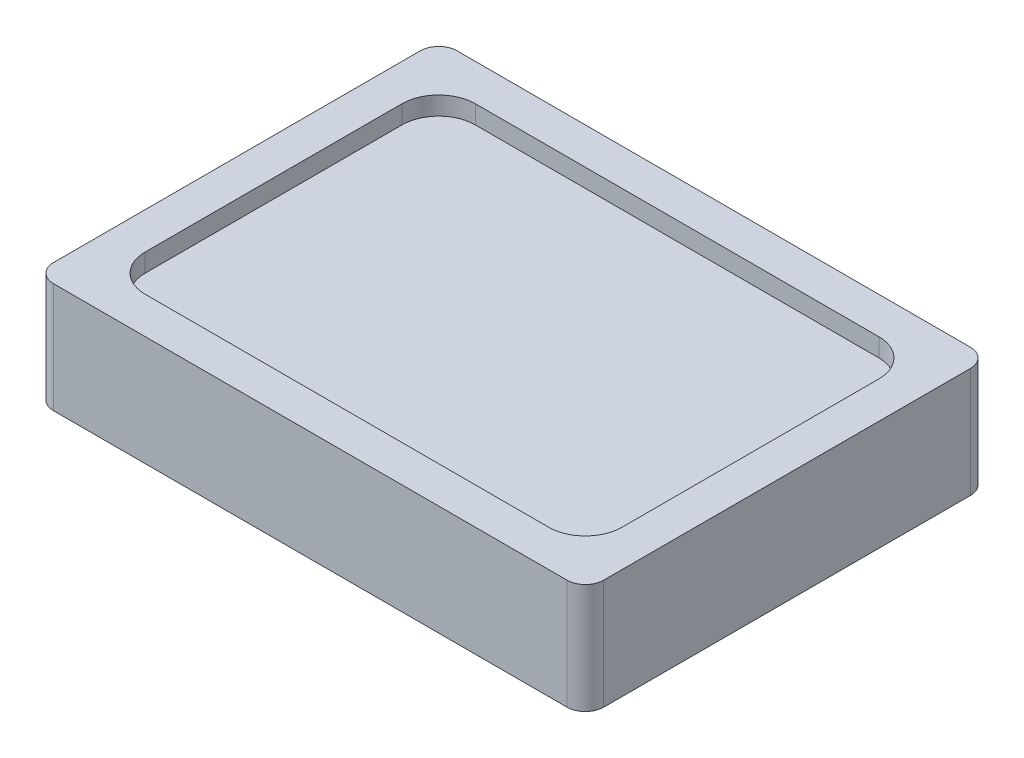
ISO-10303-21;
HEADER;
FILE_DESCRIPTION(('STEP AP214'),'2;1');
FILE_NAME('part.step','',(''),(''),'','','');
FILE_SCHEMA(('AUTOMOTIVE_DESIGN { 1 0 10303 214 1 1 1 1 }'));
ENDSEC;
DATA;
#1=APPLICATION_CONTEXT('core data for automotive mechanical design processes');
#2=APPLICATION_PROTOCOL_DEFINITION('international standard','automotive_design',2000,#1);
#3=PRODUCT_CONTEXT('',#1,'mechanical');
#4=PRODUCT('Part','Part','',(#3));
#5=PRODUCT_RELATED_PRODUCT_CATEGORY('part','',(#4));
#6=PRODUCT_DEFINITION_FORMATION('','',#4);
#7=PRODUCT_DEFINITION_CONTEXT('part definition',#1,'design');
#8=PRODUCT_DEFINITION('design','',#6,#7);
#9=PRODUCT_DEFINITION_SHAPE('','',#8);
#10=(LENGTH_UNIT() NAMED_UNIT(*) SI_UNIT(.MILLI.,.METRE.));
#11=(NAMED_UNIT(*) PLANE_ANGLE_UNIT() SI_UNIT($,.RADIAN.));
#12=(NAMED_UNIT(*) SI_UNIT($,.STERADIAN.) SOLID_ANGLE_UNIT());
#13=UNCERTAINTY_MEASURE_WITH_UNIT(LENGTH_MEASURE(1.E-05),#10,'distance_accuracy_value','');
#14=(GEOMETRIC_REPRESENTATION_CONTEXT(3) GLOBAL_UNCERTAINTY_ASSIGNED_CONTEXT((#13)) GLOBAL_UNIT_ASSIGNED_CONTEXT((#10,
#11,#12)) REPRESENTATION_CONTEXT('',''));
#15=CARTESIAN_POINT('',(0.,0.,0.));
#16=DIRECTION('',(0.,0.,1.));
#17=DIRECTION('',(1.,0.,0.));
#18=AXIS2_PLACEMENT_3D('',#15,#16,#17);
#19=CARTESIAN_POINT('',(-5.5,2.5,3.5));
#20=DIRECTION('',(0.,-1.,0.));
#21=DIRECTION('',(0.,0.,-1.));
#22=AXIS2_PLACEMENT_3D('',#19,#20,#21);
#23=PLANE('',#22);
#24=DIRECTION('',(1.,0.,0.));
#25=VECTOR('',#24,1.);
#26=CARTESIAN_POINT('',(5.5,2.5,4.5));
#27=LINE('',#26,#25);
#28=CARTESIAN_POINT('',(-5.5,2.5,4.5));
#29=VERTEX_POINT('',#28);
#30=CARTESIAN_POINT('',(5.5,2.5,4.5));
#31=VERTEX_POINT('',#30);
#32=EDGE_CURVE('E162',#29,#31,#27,.T.);
#33=ORIENTED_EDGE('',*,*,#32,.T.);
#34=CARTESIAN_POINT('',(5.5,2.5,3.5));
#35=DIRECTION('',(0.,1.,0.));
#36=DIRECTION('',(0.,0.,1.));
#37=AXIS2_PLACEMENT_3D('',#34,#35,#36);
#38=CIRCLE('',#37,0.999999999999999);
#39=CARTESIAN_POINT('',(6.5,2.5,3.5));
#40=VERTEX_POINT('',#39);
#41=EDGE_CURVE('E146',#31,#40,#38,.T.);
#42=ORIENTED_EDGE('',*,*,#41,.T.);
#43=DIRECTION('',(0.,0.,-1.));
#44=VECTOR('',#43,1.);
#45=CARTESIAN_POINT('',(6.5,2.5,-3.5));
#46=LINE('',#45,#44);
#47=CARTESIAN_POINT('',(6.5,2.5,-3.5));
#48=VERTEX_POINT('',#47);
#49=EDGE_CURVE('E163',#40,#48,#46,.T.);
#50=ORIENTED_EDGE('',*,*,#49,.T.);
#51=CARTESIAN_POINT('',(5.5,2.5,-3.5));
#52=DIRECTION('',(0.,1.,0.));
#53=DIRECTION('',(0.,0.,1.));
#54=AXIS2_PLACEMENT_3D('',#51,#52,#53);
#55=CIRCLE('',#54,1.);
#56=CARTESIAN_POINT('',(5.5,2.5,-4.5));
#57=VERTEX_POINT('',#56);
#58=EDGE_CURVE('E151',#48,#57,#55,.T.);
#59=ORIENTED_EDGE('',*,*,#58,.T.);
#60=DIRECTION('',(-1.,0.,0.));
#61=VECTOR('',#60,1.);
#62=CARTESIAN_POINT('',(5.5,2.5,-4.5));
#63=LINE('',#62,#61);
#64=CARTESIAN_POINT('',(-5.5,2.5,-4.5));
#65=VERTEX_POINT('',#64);
#66=EDGE_CURVE('E108',#57,#65,#63,.T.);
#67=ORIENTED_EDGE('',*,*,#66,.T.);
#68=CARTESIAN_POINT('',(-5.5,2.5,-3.5));
#69=DIRECTION('',(0.,1.,0.));
#70=DIRECTION('',(0.,0.,1.));
#71=AXIS2_PLACEMENT_3D('',#68,#69,#70);
#72=CIRCLE('',#71,1.);
#73=CARTESIAN_POINT('',(-6.5,2.5,-3.5));
#74=VERTEX_POINT('',#73);
#75=EDGE_CURVE('E101',#65,#74,#72,.T.);
#76=ORIENTED_EDGE('',*,*,#75,.T.);
#77=DIRECTION('',(0.,0.,1.));
#78=VECTOR('',#77,1.);
#79=CARTESIAN_POINT('',(-6.5,2.5,-3.5));
#80=LINE('',#79,#78);
#81=CARTESIAN_POINT('',(-6.5,2.5,3.5));
#82=VERTEX_POINT('',#81);
#83=EDGE_CURVE('E94',#74,#82,#80,.T.);
#84=ORIENTED_EDGE('',*,*,#83,.T.);
#85=CARTESIAN_POINT('',(-5.5,2.5,3.5));
#86=DIRECTION('',(0.,1.,0.));
#87=DIRECTION('',(0.,0.,1.));
#88=AXIS2_PLACEMENT_3D('',#85,#86,#87);
#89=CIRCLE('',#88,0.999999999999999);
#90=EDGE_CURVE('E20',#82,#29,#89,.T.);
#91=ORIENTED_EDGE('',*,*,#90,.T.);
#92=EDGE_LOOP('',(#33,#42,#50,#59,#67,#76,#84,#91));
#93=FACE_BOUND('',#92,.T.);
#94=ADVANCED_FACE('F17',(#93),#23,.F.);
#95=CARTESIAN_POINT('',(-5.5,2.5,3.5));
#96=DIRECTION('',(0.,1.,0.));
#97=DIRECTION('',(0.,0.,1.));
#98=AXIS2_PLACEMENT_3D('',#95,#96,#97);
#99=CYLINDRICAL_SURFACE('',#98,0.999999999999999);
#100=DIRECTION('',(0.,1.,0.));
#101=VECTOR('',#100,1.);
#102=CARTESIAN_POINT('',(-5.5,2.5,4.5));
#103=LINE('',#102,#101);
#104=CARTESIAN_POINT('',(-5.5,3.,4.5));
#105=VERTEX_POINT('',#104);
#106=EDGE_CURVE('E89',#105,#29,#103,.F.);
#107=ORIENTED_EDGE('',*,*,#106,.T.);
#108=ORIENTED_EDGE('',*,*,#90,.F.);
#109=DIRECTION('',(0.,1.,0.));
#110=VECTOR('',#109,1.);
#111=CARTESIAN_POINT('',(-6.5,2.5,3.5));
#112=LINE('',#111,#110);
#113=CARTESIAN_POINT('',(-6.5,3.,3.5));
#114=VERTEX_POINT('',#113);
#115=EDGE_CURVE('E86',#82,#114,#112,.T.);
#116=ORIENTED_EDGE('',*,*,#115,.T.);
#117=CARTESIAN_POINT('',(-5.5,3.,3.5));
#118=DIRECTION('',(0.,1.,0.));
#119=DIRECTION('',(0.,0.,1.));
#120=AXIS2_PLACEMENT_3D('',#117,#118,#119);
#121=CIRCLE('',#120,0.999999999999999);
#122=EDGE_CURVE('E137',#105,#114,#121,.F.);
#123=ORIENTED_EDGE('',*,*,#122,.F.);
#124=EDGE_LOOP('',(#107,#108,#116,#123));
#125=FACE_BOUND('',#124,.T.);
#126=ADVANCED_FACE('F84',(#125),#99,.F.);
#127=CARTESIAN_POINT('',(-6.5,2.5,-3.5));
#128=DIRECTION('',(-1.,0.,0.));
#129=DIRECTION('',(0.,0.,1.));
#130=AXIS2_PLACEMENT_3D('',#127,#128,#129);
#131=PLANE('',#130);
#132=ORIENTED_EDGE('',*,*,#115,.F.);
#133=ORIENTED_EDGE('',*,*,#83,.F.);
#134=DIRECTION('',(0.,1.,0.));
#135=VECTOR('',#134,1.);
#136=CARTESIAN_POINT('',(-6.5,2.5,-3.5));
#137=LINE('',#136,#135);
#138=CARTESIAN_POINT('',(-6.5,3.,-3.5));
#139=VERTEX_POINT('',#138);
#140=EDGE_CURVE('E155',#74,#139,#137,.T.);
#141=ORIENTED_EDGE('',*,*,#140,.T.);
#142=DIRECTION('',(0.,0.,1.));
#143=VECTOR('',#142,1.);
#144=CARTESIAN_POINT('',(-6.5,3.,-5.));
#145=LINE('',#144,#143);
#146=EDGE_CURVE('E100',#114,#139,#145,.F.);
#147=ORIENTED_EDGE('',*,*,#146,.F.);
#148=EDGE_LOOP('',(#132,#133,#141,#147));
#149=FACE_BOUND('',#148,.T.);
#150=ADVANCED_FACE('F96',(#149),#131,.F.);
#151=CARTESIAN_POINT('',(-5.5,2.5,-3.5));
#152=DIRECTION('',(0.,1.,0.));
#153=DIRECTION('',(0.,0.,1.));
#154=AXIS2_PLACEMENT_3D('',#151,#152,#153);
#155=CYLINDRICAL_SURFACE('',#154,1.);
#156=ORIENTED_EDGE('',*,*,#140,.F.);
#157=ORIENTED_EDGE('',*,*,#75,.F.);
#158=DIRECTION('',(0.,1.,0.));
#159=VECTOR('',#158,1.);
#160=CARTESIAN_POINT('',(-5.5,2.5,-4.5));
#161=LINE('',#160,#159);
#162=CARTESIAN_POINT('',(-5.5,3.,-4.5));
#163=VERTEX_POINT('',#162);
#164=EDGE_CURVE('E154',#65,#163,#161,.T.);
#165=ORIENTED_EDGE('',*,*,#164,.T.);
#166=CARTESIAN_POINT('',(-5.5,3.,-3.5));
#167=DIRECTION('',(0.,1.,0.));
#168=DIRECTION('',(0.,0.,1.));
#169=AXIS2_PLACEMENT_3D('',#166,#167,#168);
#170=CIRCLE('',#169,1.);
#171=EDGE_CURVE('E134',#139,#163,#170,.F.);
#172=ORIENTED_EDGE('',*,*,#171,.F.);
#173=EDGE_LOOP('',(#156,#157,#165,#172));
#174=FACE_BOUND('',#173,.T.);
#175=ADVANCED_FACE('F292',(#174),#155,.F.);
#176=CARTESIAN_POINT('',(5.5,2.5,-4.5));
#177=DIRECTION('',(0.,0.,-1.));
#178=DIRECTION('',(-1.,0.,0.));
#179=AXIS2_PLACEMENT_3D('',#176,#177,#178);
#180=PLANE('',#179);
#181=ORIENTED_EDGE('',*,*,#164,.F.);
#182=ORIENTED_EDGE('',*,*,#66,.F.);
#183=DIRECTION('',(0.,1.,0.));
#184=VECTOR('',#183,1.);
#185=CARTESIAN_POINT('',(5.5,2.5,-4.5));
#186=LINE('',#185,#184);
#187=CARTESIAN_POINT('',(5.5,3.,-4.5));
#188=VERTEX_POINT('',#187);
#189=EDGE_CURVE('E153',#57,#188,#186,.T.);
#190=ORIENTED_EDGE('',*,*,#189,.T.);
#191=DIRECTION('',(1.,0.,0.));
#192=VECTOR('',#191,1.);
#193=CARTESIAN_POINT('',(7.,3.,-4.5));
#194=LINE('',#193,#192);
#195=EDGE_CURVE('E133',#163,#188,#194,.T.);
#196=ORIENTED_EDGE('',*,*,#195,.F.);
#197=EDGE_LOOP('',(#181,#182,#190,#196));
#198=FACE_BOUND('',#197,.T.);
#199=ADVANCED_FACE('F289',(#198),#180,.F.);
#200=CARTESIAN_POINT('',(5.5,2.5,-3.5));
#201=DIRECTION('',(0.,1.,0.));
#202=DIRECTION('',(0.,0.,1.));
#203=AXIS2_PLACEMENT_3D('',#200,#201,#202);
#204=CYLINDRICAL_SURFACE('',#203,1.);
#205=ORIENTED_EDGE('',*,*,#189,.F.);
#206=ORIENTED_EDGE('',*,*,#58,.F.);
#207=DIRECTION('',(0.,1.,0.));
#208=VECTOR('',#207,1.);
#209=CARTESIAN_POINT('',(6.5,2.5,-3.5));
#210=LINE('',#209,#208);
#211=CARTESIAN_POINT('',(6.5,3.,-3.5));
#212=VERTEX_POINT('',#211);
#213=EDGE_CURVE('E150',#48,#212,#210,.T.);
#214=ORIENTED_EDGE('',*,*,#213,.T.);
#215=CARTESIAN_POINT('',(5.5,3.,-3.5));
#216=DIRECTION('',(0.,1.,0.));
#217=DIRECTION('',(0.,0.,1.));
#218=AXIS2_PLACEMENT_3D('',#215,#216,#217);
#219=CIRCLE('',#218,1.);
#220=EDGE_CURVE('E130',#188,#212,#219,.F.);
#221=ORIENTED_EDGE('',*,*,#220,.F.);
#222=EDGE_LOOP('',(#205,#206,#214,#221));
#223=FACE_BOUND('',#222,.T.);
#224=ADVANCED_FACE('F287',(#223),#204,.F.);
#225=CARTESIAN_POINT('',(6.5,2.5,-3.5));
#226=DIRECTION('',(1.,0.,0.));
#227=DIRECTION('',(0.,0.,-1.));
#228=AXIS2_PLACEMENT_3D('',#225,#226,#227);
#229=PLANE('',#228);
#230=ORIENTED_EDGE('',*,*,#213,.F.);
#231=ORIENTED_EDGE('',*,*,#49,.F.);
#232=DIRECTION('',(0.,1.,0.));
#233=VECTOR('',#232,1.);
#234=CARTESIAN_POINT('',(6.5,2.5,3.5));
#235=LINE('',#234,#233);
#236=CARTESIAN_POINT('',(6.5,3.,3.5));
#237=VERTEX_POINT('',#236);
#238=EDGE_CURVE('E149',#40,#237,#235,.T.);
#239=ORIENTED_EDGE('',*,*,#238,.T.);
#240=DIRECTION('',(0.,0.,1.));
#241=VECTOR('',#240,1.);
#242=CARTESIAN_POINT('',(6.5,3.,-5.));
#243=LINE('',#242,#241);
#244=EDGE_CURVE('E129',#212,#237,#243,.T.);
#245=ORIENTED_EDGE('',*,*,#244,.F.);
#246=EDGE_LOOP('',(#230,#231,#239,#245));
#247=FACE_BOUND('',#246,.T.);
#248=ADVANCED_FACE('F285',(#247),#229,.F.);
#249=CARTESIAN_POINT('',(5.5,2.5,3.5));
#250=DIRECTION('',(0.,1.,0.));
#251=DIRECTION('',(0.,0.,1.));
#252=AXIS2_PLACEMENT_3D('',#249,#250,#251);
#253=CYLINDRICAL_SURFACE('',#252,0.999999999999999);
#254=ORIENTED_EDGE('',*,*,#238,.F.);
#255=ORIENTED_EDGE('',*,*,#41,.F.);
#256=DIRECTION('',(0.,1.,0.));
#257=VECTOR('',#256,1.);
#258=CARTESIAN_POINT('',(5.5,2.5,4.5));
#259=LINE('',#258,#257);
#260=CARTESIAN_POINT('',(5.5,3.,4.5));
#261=VERTEX_POINT('',#260);
#262=EDGE_CURVE('E145',#31,#261,#259,.T.);
#263=ORIENTED_EDGE('',*,*,#262,.T.);
#264=CARTESIAN_POINT('',(5.5,3.,3.5));
#265=DIRECTION('',(0.,1.,0.));
#266=DIRECTION('',(0.,0.,1.));
#267=AXIS2_PLACEMENT_3D('',#264,#265,#266);
#268=CIRCLE('',#267,0.999999999999999);
#269=EDGE_CURVE('E126',#237,#261,#268,.F.);
#270=ORIENTED_EDGE('',*,*,#269,.F.);
#271=EDGE_LOOP('',(#254,#255,#263,#270));
#272=FACE_BOUND('',#271,.T.);
#273=ADVANCED_FACE('F281',(#272),#253,.F.);
#274=CARTESIAN_POINT('',(5.5,2.5,4.5));
#275=DIRECTION('',(0.,0.,1.));
#276=DIRECTION('',(1.,0.,0.));
#277=AXIS2_PLACEMENT_3D('',#274,#275,#276);
#278=PLANE('',#277);
#279=ORIENTED_EDGE('',*,*,#262,.F.);
#280=ORIENTED_EDGE('',*,*,#32,.F.);
#281=ORIENTED_EDGE('',*,*,#106,.F.);
#282=DIRECTION('',(1.,0.,0.));
#283=VECTOR('',#282,1.);
#284=CARTESIAN_POINT('',(7.,3.,4.5));
#285=LINE('',#284,#283);
#286=EDGE_CURVE('E125',#261,#105,#285,.F.);
#287=ORIENTED_EDGE('',*,*,#286,.F.);
#288=EDGE_LOOP('',(#279,#280,#281,#287));
#289=FACE_BOUND('',#288,.T.);
#290=ADVANCED_FACE('F278',(#289),#278,.F.);
#291=CARTESIAN_POINT('',(-7.,3.,-5.));
#292=DIRECTION('',(0.,-1.,0.));
#293=DIRECTION('',(0.,0.,-1.));
#294=AXIS2_PLACEMENT_3D('',#291,#292,#293);
#295=CYLINDRICAL_SURFACE('',#294,0.5);
#296=CARTESIAN_POINT('',(-7.,3.,-5.));
#297=DIRECTION('',(0.,-1.,0.));
#298=DIRECTION('',(0.,0.,-1.));
#299=AXIS2_PLACEMENT_3D('',#296,#297,#298);
#300=CIRCLE('',#299,0.5);
#301=CARTESIAN_POINT('',(-7.,3.,-5.5));
#302=VERTEX_POINT('',#301);
#303=CARTESIAN_POINT('',(-7.5,3.,-5.));
#304=VERTEX_POINT('',#303);
#305=EDGE_CURVE('E119',#302,#304,#300,.F.);
#306=ORIENTED_EDGE('',*,*,#305,.F.);
#307=DIRECTION('',(0.,1.,0.));
#308=VECTOR('',#307,1.);
#309=CARTESIAN_POINT('',(-6.99999999999999,3.,-5.5));
#310=LINE('',#309,#308);
#311=CARTESIAN_POINT('',(-7.,0.,-5.5));
#312=VERTEX_POINT('',#311);
#313=EDGE_CURVE('E182',#302,#312,#310,.F.);
#314=ORIENTED_EDGE('',*,*,#313,.T.);
#315=CARTESIAN_POINT('',(-7.,0.,-5.));
#316=DIRECTION('',(0.,-1.,0.));
#317=DIRECTION('',(0.,0.,-1.));
#318=AXIS2_PLACEMENT_3D('',#315,#316,#317);
#319=CIRCLE('',#318,0.5);
#320=CARTESIAN_POINT('',(-7.5,0.,-5.));
#321=VERTEX_POINT('',#320);
#322=EDGE_CURVE('E143',#312,#321,#319,.F.);
#323=ORIENTED_EDGE('',*,*,#322,.T.);
#324=DIRECTION('',(0.,1.,0.));
#325=VECTOR('',#324,1.);
#326=CARTESIAN_POINT('',(-7.5,3.,-4.99999999999999));
#327=LINE('',#326,#325);
#328=EDGE_CURVE('E187',#321,#304,#327,.T.);
#329=ORIENTED_EDGE('',*,*,#328,.T.);
#330=EDGE_LOOP('',(#306,#314,#323,#329));
#331=FACE_BOUND('',#330,.T.);
#332=ADVANCED_FACE('F331',(#331),#295,.T.);
#333=CARTESIAN_POINT('',(-7.,3.,5.));
#334=DIRECTION('',(0.,-1.,0.));
#335=DIRECTION('',(0.,0.,-1.));
#336=AXIS2_PLACEMENT_3D('',#333,#334,#335);
#337=CYLINDRICAL_SURFACE('',#336,0.5);
#338=CARTESIAN_POINT('',(-7.,3.,5.));
#339=DIRECTION('',(0.,-1.,0.));
#340=DIRECTION('',(0.,0.,-1.));
#341=AXIS2_PLACEMENT_3D('',#338,#339,#340);
#342=CIRCLE('',#341,0.5);
#343=CARTESIAN_POINT('',(-7.5,3.,5.));
#344=VERTEX_POINT('',#343);
#345=CARTESIAN_POINT('',(-7.,3.,5.5));
#346=VERTEX_POINT('',#345);
#347=EDGE_CURVE('E116',#344,#346,#342,.F.);
#348=ORIENTED_EDGE('',*,*,#347,.F.);
#349=DIRECTION('',(0.,1.,0.));
#350=VECTOR('',#349,1.);
#351=CARTESIAN_POINT('',(-7.5,3.,5.));
#352=LINE('',#351,#350);
#353=CARTESIAN_POINT('',(-7.5,0.,5.));
#354=VERTEX_POINT('',#353);
#355=EDGE_CURVE('E186',#344,#354,#352,.F.);
#356=ORIENTED_EDGE('',*,*,#355,.T.);
#357=CARTESIAN_POINT('',(-7.,0.,5.));
#358=DIRECTION('',(0.,-1.,0.));
#359=DIRECTION('',(0.,0.,-1.));
#360=AXIS2_PLACEMENT_3D('',#357,#358,#359);
#361=CIRCLE('',#360,0.5);
#362=CARTESIAN_POINT('',(-7.,0.,5.5));
#363=VERTEX_POINT('',#362);
#364=EDGE_CURVE('E141',#354,#363,#361,.F.);
#365=ORIENTED_EDGE('',*,*,#364,.T.);
#366=DIRECTION('',(0.,1.,0.));
#367=VECTOR('',#366,1.);
#368=CARTESIAN_POINT('',(-7.,3.,5.5));
#369=LINE('',#368,#367);
#370=EDGE_CURVE('E191',#346,#363,#369,.F.);
#371=ORIENTED_EDGE('',*,*,#370,.F.);
#372=EDGE_LOOP('',(#348,#356,#365,#371));
#373=FACE_BOUND('',#372,.T.);
#374=ADVANCED_FACE('F327',(#373),#337,.T.);
#375=CARTESIAN_POINT('',(7.,3.,-5.));
#376=DIRECTION('',(0.,-1.,0.));
#377=DIRECTION('',(0.,0.,-1.));
#378=AXIS2_PLACEMENT_3D('',#375,#376,#377);
#379=CYLINDRICAL_SURFACE('',#378,0.5);
#380=CARTESIAN_POINT('',(7.,3.,-5.));
#381=DIRECTION('',(0.,-1.,0.));
#382=DIRECTION('',(0.,0.,-1.));
#383=AXIS2_PLACEMENT_3D('',#380,#381,#382);
#384=CIRCLE('',#383,0.5);
#385=CARTESIAN_POINT('',(7.5,3.,-5.));
#386=VERTEX_POINT('',#385);
#387=CARTESIAN_POINT('',(7.,3.,-5.5));
#388=VERTEX_POINT('',#387);
#389=EDGE_CURVE('E122',#386,#388,#384,.F.);
#390=ORIENTED_EDGE('',*,*,#389,.F.);
#391=DIRECTION('',(0.,1.,0.));
#392=VECTOR('',#391,1.);
#393=CARTESIAN_POINT('',(7.5,3.,-5.));
#394=LINE('',#393,#392);
#395=CARTESIAN_POINT('',(7.5,0.,-5.));
#396=VERTEX_POINT('',#395);
#397=EDGE_CURVE('E204',#396,#386,#394,.T.);
#398=ORIENTED_EDGE('',*,*,#397,.F.);
#399=CARTESIAN_POINT('',(7.,0.,-5.));
#400=DIRECTION('',(0.,-1.,0.));
#401=DIRECTION('',(0.,0.,-1.));
#402=AXIS2_PLACEMENT_3D('',#399,#400,#401);
#403=CIRCLE('',#402,0.5);
#404=CARTESIAN_POINT('',(7.,0.,-5.5));
#405=VERTEX_POINT('',#404);
#406=EDGE_CURVE('E35',#396,#405,#403,.F.);
#407=ORIENTED_EDGE('',*,*,#406,.T.);
#408=DIRECTION('',(0.,1.,0.));
#409=VECTOR('',#408,1.);
#410=CARTESIAN_POINT('',(7.,3.,-5.5));
#411=LINE('',#410,#409);
#412=EDGE_CURVE('E113',#405,#388,#411,.T.);
#413=ORIENTED_EDGE('',*,*,#412,.T.);
#414=EDGE_LOOP('',(#390,#398,#407,#413));
#415=FACE_BOUND('',#414,.T.);
#416=ADVANCED_FACE('F324',(#415),#379,.T.);
#417=CARTESIAN_POINT('',(7.,3.,-5.));
#418=DIRECTION('',(0.,1.,0.));
#419=DIRECTION('',(0.,0.,1.));
#420=AXIS2_PLACEMENT_3D('',#417,#418,#419);
#421=PLANE('',#420);
#422=CARTESIAN_POINT('',(7.,3.,5.));
#423=DIRECTION('',(0.,-1.,0.));
#424=DIRECTION('',(0.,0.,-1.));
#425=AXIS2_PLACEMENT_3D('',#422,#423,#424);
#426=CIRCLE('',#425,0.5);
#427=CARTESIAN_POINT('',(7.5,3.,5.));
#428=VERTEX_POINT('',#427);
#429=CARTESIAN_POINT('',(7.,3.,5.5));
#430=VERTEX_POINT('',#429);
#431=EDGE_CURVE('E110',#428,#430,#426,.T.);
#432=ORIENTED_EDGE('',*,*,#431,.F.);
#433=DIRECTION('',(0.,0.,-1.));
#434=VECTOR('',#433,1.);
#435=CARTESIAN_POINT('',(7.5,3.,-5.));
#436=LINE('',#435,#434);
#437=EDGE_CURVE('E200',#386,#428,#436,.F.);
#438=ORIENTED_EDGE('',*,*,#437,.F.);
#439=ORIENTED_EDGE('',*,*,#389,.T.);
#440=DIRECTION('',(1.,0.,0.));
#441=VECTOR('',#440,1.);
#442=CARTESIAN_POINT('',(7.,3.,-5.5));
#443=LINE('',#442,#441);
#444=EDGE_CURVE('E179',#388,#302,#443,.F.);
#445=ORIENTED_EDGE('',*,*,#444,.T.);
#446=ORIENTED_EDGE('',*,*,#305,.T.);
#447=DIRECTION('',(0.,0.,-1.));
#448=VECTOR('',#447,1.);
#449=CARTESIAN_POINT('',(-7.5,3.,-4.99999999999999));
#450=LINE('',#449,#448);
#451=EDGE_CURVE('E183',#304,#344,#450,.F.);
#452=ORIENTED_EDGE('',*,*,#451,.T.);
#453=ORIENTED_EDGE('',*,*,#347,.T.);
#454=DIRECTION('',(1.,0.,0.));
#455=VECTOR('',#454,1.);
#456=CARTESIAN_POINT('',(7.,3.,5.5));
#457=LINE('',#456,#455);
#458=EDGE_CURVE('E188',#430,#346,#457,.F.);
#459=ORIENTED_EDGE('',*,*,#458,.F.);
#460=EDGE_LOOP('',(#432,#438,#439,#445,#446,#452,#453,#459));
#461=FACE_BOUND('',#460,.T.);
#462=ORIENTED_EDGE('',*,*,#269,.T.);
#463=ORIENTED_EDGE('',*,*,#286,.T.);
#464=ORIENTED_EDGE('',*,*,#122,.T.);
#465=ORIENTED_EDGE('',*,*,#146,.T.);
#466=ORIENTED_EDGE('',*,*,#171,.T.);
#467=ORIENTED_EDGE('',*,*,#195,.T.);
#468=ORIENTED_EDGE('',*,*,#220,.T.);
#469=ORIENTED_EDGE('',*,*,#244,.T.);
#470=EDGE_LOOP('',(#462,#463,#464,#465,#466,#467,#468,#469));
#471=FACE_BOUND('',#470,.T.);
#472=ADVANCED_FACE('F248',(#461,#471),#421,.T.);
#473=CARTESIAN_POINT('',(7.,3.,5.));
#474=DIRECTION('',(0.,-1.,0.));
#475=DIRECTION('',(0.,0.,-1.));
#476=AXIS2_PLACEMENT_3D('',#473,#474,#475);
#477=CYLINDRICAL_SURFACE('',#476,0.5);
#478=ORIENTED_EDGE('',*,*,#431,.T.);
#479=DIRECTION('',(0.,1.,0.));
#480=VECTOR('',#479,1.);
#481=CARTESIAN_POINT('',(7.,3.,5.5));
#482=LINE('',#481,#480);
#483=CARTESIAN_POINT('',(7.,0.,5.5));
#484=VERTEX_POINT('',#483);
#485=EDGE_CURVE('E192',#484,#430,#482,.T.);
#486=ORIENTED_EDGE('',*,*,#485,.F.);
#487=CARTESIAN_POINT('',(7.,0.,5.));
#488=DIRECTION('',(0.,-1.,0.));
#489=DIRECTION('',(0.,0.,-1.));
#490=AXIS2_PLACEMENT_3D('',#487,#488,#489);
#491=CIRCLE('',#490,0.5);
#492=CARTESIAN_POINT('',(7.5,0.,5.));
#493=VERTEX_POINT('',#492);
#494=EDGE_CURVE('E114',#484,#493,#491,.F.);
#495=ORIENTED_EDGE('',*,*,#494,.T.);
#496=DIRECTION('',(0.,1.,0.));
#497=VECTOR('',#496,1.);
#498=CARTESIAN_POINT('',(7.5,3.,5.));
#499=LINE('',#498,#497);
#500=EDGE_CURVE('E203',#428,#493,#499,.F.);
#501=ORIENTED_EDGE('',*,*,#500,.F.);
#502=EDGE_LOOP('',(#478,#486,#495,#501));
#503=FACE_BOUND('',#502,.T.);
#504=ADVANCED_FACE('F241',(#503),#477,.T.);
#505=CARTESIAN_POINT('',(7.,3.,-5.5));
#506=DIRECTION('',(0.,0.,1.));
#507=DIRECTION('',(1.,0.,0.));
#508=AXIS2_PLACEMENT_3D('',#505,#506,#507);
#509=PLANE('',#508);
#510=ORIENTED_EDGE('',*,*,#313,.F.);
#511=ORIENTED_EDGE('',*,*,#444,.F.);
#512=ORIENTED_EDGE('',*,*,#412,.F.);
#513=DIRECTION('',(1.,0.,0.));
#514=VECTOR('',#513,1.);
#515=CARTESIAN_POINT('',(7.,0.,-5.5));
#516=LINE('',#515,#514);
#517=EDGE_CURVE('E221',#405,#312,#516,.F.);
#518=ORIENTED_EDGE('',*,*,#517,.T.);
#519=EDGE_LOOP('',(#510,#511,#512,#518));
#520=FACE_BOUND('',#519,.T.);
#521=ADVANCED_FACE('F315',(#520),#509,.F.);
#522=CARTESIAN_POINT('',(-7.5,3.,-4.99999999999999));
#523=DIRECTION('',(1.,0.,0.));
#524=DIRECTION('',(0.,0.,-1.));
#525=AXIS2_PLACEMENT_3D('',#522,#523,#524);
#526=PLANE('',#525);
#527=ORIENTED_EDGE('',*,*,#355,.F.);
#528=ORIENTED_EDGE('',*,*,#451,.F.);
#529=ORIENTED_EDGE('',*,*,#328,.F.);
#530=DIRECTION('',(0.,0.,1.));
#531=VECTOR('',#530,1.);
#532=CARTESIAN_POINT('',(-7.5,0.,-5.));
#533=LINE('',#532,#531);
#534=EDGE_CURVE('E224',#321,#354,#533,.T.);
#535=ORIENTED_EDGE('',*,*,#534,.T.);
#536=EDGE_LOOP('',(#527,#528,#529,#535));
#537=FACE_BOUND('',#536,.T.);
#538=ADVANCED_FACE('F312',(#537),#526,.F.);
#539=CARTESIAN_POINT('',(7.,3.,5.5));
#540=DIRECTION('',(0.,0.,1.));
#541=DIRECTION('',(1.,0.,0.));
#542=AXIS2_PLACEMENT_3D('',#539,#540,#541);
#543=PLANE('',#542);
#544=ORIENTED_EDGE('',*,*,#458,.T.);
#545=ORIENTED_EDGE('',*,*,#370,.T.);
#546=DIRECTION('',(1.,0.,0.));
#547=VECTOR('',#546,1.);
#548=CARTESIAN_POINT('',(7.,0.,5.5));
#549=LINE('',#548,#547);
#550=EDGE_CURVE('E26',#363,#484,#549,.T.);
#551=ORIENTED_EDGE('',*,*,#550,.T.);
#552=ORIENTED_EDGE('',*,*,#485,.T.);
#553=EDGE_LOOP('',(#544,#545,#551,#552));
#554=FACE_BOUND('',#553,.T.);
#555=ADVANCED_FACE('F230',(#554),#543,.T.);
#556=CARTESIAN_POINT('',(7.5,3.,-5.));
#557=DIRECTION('',(1.,0.,0.));
#558=DIRECTION('',(0.,0.,-1.));
#559=AXIS2_PLACEMENT_3D('',#556,#557,#558);
#560=PLANE('',#559);
#561=ORIENTED_EDGE('',*,*,#437,.T.);
#562=ORIENTED_EDGE('',*,*,#500,.T.);
#563=DIRECTION('',(0.,0.,1.));
#564=VECTOR('',#563,1.);
#565=CARTESIAN_POINT('',(7.5,0.,-5.));
#566=LINE('',#565,#564);
#567=EDGE_CURVE('E11',#493,#396,#566,.F.);
#568=ORIENTED_EDGE('',*,*,#567,.T.);
#569=ORIENTED_EDGE('',*,*,#397,.T.);
#570=EDGE_LOOP('',(#561,#562,#568,#569));
#571=FACE_BOUND('',#570,.T.);
#572=ADVANCED_FACE('F303',(#571),#560,.T.);
#573=CARTESIAN_POINT('',(7.,0.,-5.));
#574=DIRECTION('',(0.,1.,0.));
#575=DIRECTION('',(0.,0.,1.));
#576=AXIS2_PLACEMENT_3D('',#573,#574,#575);
#577=PLANE('',#576);
#578=ORIENTED_EDGE('',*,*,#567,.F.);
#579=ORIENTED_EDGE('',*,*,#494,.F.);
#580=ORIENTED_EDGE('',*,*,#550,.F.);
#581=ORIENTED_EDGE('',*,*,#364,.F.);
#582=ORIENTED_EDGE('',*,*,#534,.F.);
#583=ORIENTED_EDGE('',*,*,#322,.F.);
#584=ORIENTED_EDGE('',*,*,#517,.F.);
#585=ORIENTED_EDGE('',*,*,#406,.F.);
#586=EDGE_LOOP('',(#578,#579,#580,#581,#582,#583,#584,#585));
#587=FACE_BOUND('',#586,.T.);
#588=ADVANCED_FACE('F237',(#587),#577,.F.);
#589=CLOSED_SHELL('',(#94,#126,#150,#175,#199,#224,#248,#273,#290,#332,#374,#416,#472,#504,#521,
#538,#555,#572,#588));
#590=MANIFOLD_SOLID_BREP('B1',#589);
#591=ADVANCED_BREP_SHAPE_REPRESENTATION('',(#18,#590),#14);
#592=SHAPE_DEFINITION_REPRESENTATION(#9,#591);
ENDSEC;
END-ISO-10303-21;
